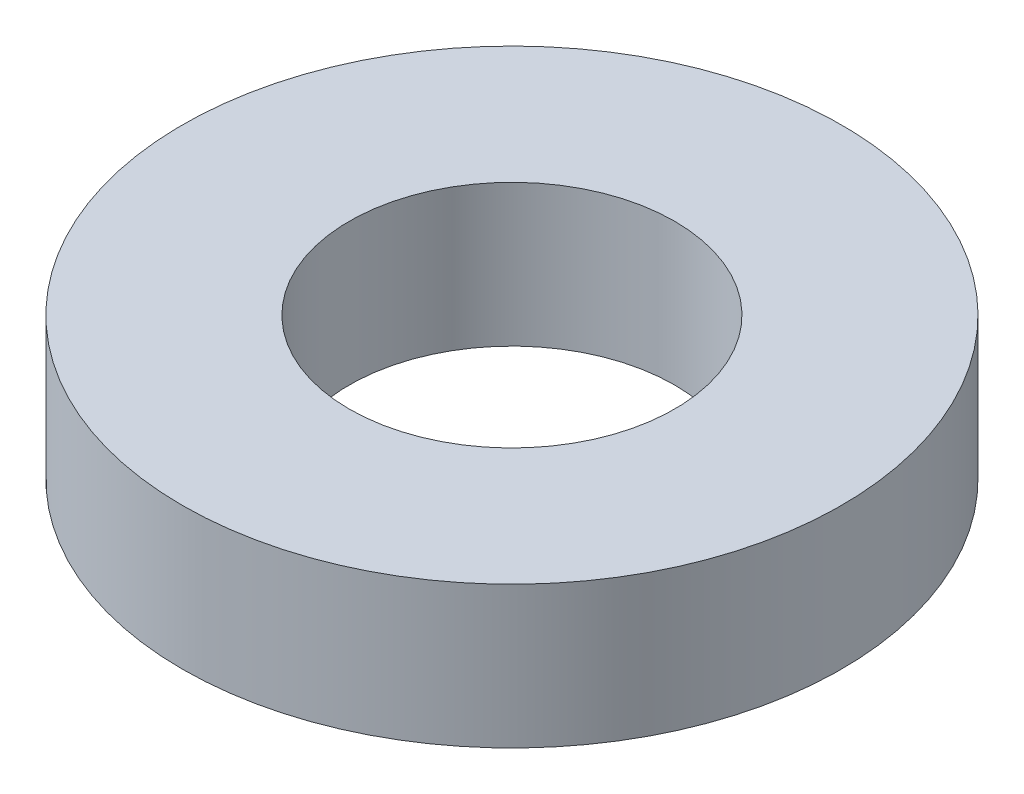
ISO-10303-21;
HEADER;
FILE_DESCRIPTION(('STEP AP214'),'2;1');
FILE_NAME('part.step','',(''),(''),'','','');
FILE_SCHEMA(('AUTOMOTIVE_DESIGN { 1 0 10303 214 1 1 1 1 }'));
ENDSEC;
DATA;
#1=APPLICATION_CONTEXT('core data for automotive mechanical design processes');
#2=APPLICATION_PROTOCOL_DEFINITION('international standard','automotive_design',2000,#1);
#3=PRODUCT_CONTEXT('',#1,'mechanical');
#4=PRODUCT('Part','Part','',(#3));
#5=PRODUCT_RELATED_PRODUCT_CATEGORY('part','',(#4));
#6=PRODUCT_DEFINITION_FORMATION('','',#4);
#7=PRODUCT_DEFINITION_CONTEXT('part definition',#1,'design');
#8=PRODUCT_DEFINITION('design','',#6,#7);
#9=PRODUCT_DEFINITION_SHAPE('','',#8);
#10=(LENGTH_UNIT() NAMED_UNIT(*) SI_UNIT(.MILLI.,.METRE.));
#11=(NAMED_UNIT(*) PLANE_ANGLE_UNIT() SI_UNIT($,.RADIAN.));
#12=(NAMED_UNIT(*) SI_UNIT($,.STERADIAN.) SOLID_ANGLE_UNIT());
#13=UNCERTAINTY_MEASURE_WITH_UNIT(LENGTH_MEASURE(1.E-05),#10,'distance_accuracy_value','');
#14=(GEOMETRIC_REPRESENTATION_CONTEXT(3) GLOBAL_UNCERTAINTY_ASSIGNED_CONTEXT((#13)) GLOBAL_UNIT_ASSIGNED_CONTEXT((#10,
#11,#12)) REPRESENTATION_CONTEXT('',''));
#15=CARTESIAN_POINT('',(0.,0.,0.));
#16=DIRECTION('',(0.,0.,1.));
#17=DIRECTION('',(1.,0.,0.));
#18=AXIS2_PLACEMENT_3D('',#15,#16,#17);
#19=CARTESIAN_POINT('',(0.,17.,0.));
#20=DIRECTION('',(0.,1.,0.));
#21=DIRECTION('',(0.,0.,1.));
#22=AXIS2_PLACEMENT_3D('',#19,#20,#21);
#23=PLANE('',#22);
#24=CARTESIAN_POINT('',(0.,17.,0.));
#25=DIRECTION('',(0.,1.,0.));
#26=DIRECTION('',(0.,0.,1.));
#27=AXIS2_PLACEMENT_3D('',#24,#25,#26);
#28=CIRCLE('',#27,39.5);
#29=CARTESIAN_POINT('',(0.,17.,39.5));
#30=VERTEX_POINT('',#29);
#31=EDGE_CURVE('E10',#30,#30,#28,.T.);
#32=ORIENTED_EDGE('',*,*,#31,.T.);
#33=EDGE_LOOP('',(#32));
#34=FACE_BOUND('',#33,.T.);
#35=CARTESIAN_POINT('',(0.,17.,0.));
#36=DIRECTION('',(0.,1.,0.));
#37=DIRECTION('',(0.,0.,1.));
#38=AXIS2_PLACEMENT_3D('',#35,#36,#37);
#39=CIRCLE('',#38,19.5);
#40=CARTESIAN_POINT('',(0.,17.,19.5));
#41=VERTEX_POINT('',#40);
#42=EDGE_CURVE('E42',#41,#41,#39,.T.);
#43=ORIENTED_EDGE('',*,*,#42,.F.);
#44=EDGE_LOOP('',(#43));
#45=FACE_BOUND('',#44,.T.);
#46=ADVANCED_FACE('F31',(#34,#45),#23,.T.);
#47=CARTESIAN_POINT('',(0.,0.,0.));
#48=DIRECTION('',(0.,1.,0.));
#49=DIRECTION('',(0.,0.,1.));
#50=AXIS2_PLACEMENT_3D('',#47,#48,#49);
#51=PLANE('',#50);
#52=CARTESIAN_POINT('',(0.,0.,0.));
#53=DIRECTION('',(0.,1.,0.));
#54=DIRECTION('',(0.,0.,1.));
#55=AXIS2_PLACEMENT_3D('',#52,#53,#54);
#56=CIRCLE('',#55,39.5);
#57=CARTESIAN_POINT('',(0.,0.,39.5));
#58=VERTEX_POINT('',#57);
#59=EDGE_CURVE('E35',#58,#58,#56,.T.);
#60=ORIENTED_EDGE('',*,*,#59,.F.);
#61=EDGE_LOOP('',(#60));
#62=FACE_BOUND('',#61,.T.);
#63=CARTESIAN_POINT('',(0.,0.,0.));
#64=DIRECTION('',(0.,1.,0.));
#65=DIRECTION('',(0.,0.,1.));
#66=AXIS2_PLACEMENT_3D('',#63,#64,#65);
#67=CIRCLE('',#66,19.5);
#68=CARTESIAN_POINT('',(0.,0.,19.5));
#69=VERTEX_POINT('',#68);
#70=EDGE_CURVE('E44',#69,#69,#67,.T.);
#71=ORIENTED_EDGE('',*,*,#70,.T.);
#72=EDGE_LOOP('',(#71));
#73=FACE_BOUND('',#72,.T.);
#74=ADVANCED_FACE('F54',(#62,#73),#51,.F.);
#75=CARTESIAN_POINT('',(0.,17.,0.));
#76=DIRECTION('',(0.,-1.,0.));
#77=DIRECTION('',(0.,0.,-1.));
#78=AXIS2_PLACEMENT_3D('',#75,#76,#77);
#79=CYLINDRICAL_SURFACE('',#78,39.5);
#80=ORIENTED_EDGE('',*,*,#31,.F.);
#81=EDGE_LOOP('',(#80));
#82=FACE_BOUND('',#81,.T.);
#83=ORIENTED_EDGE('',*,*,#59,.T.);
#84=EDGE_LOOP('',(#83));
#85=FACE_BOUND('',#84,.T.);
#86=ADVANCED_FACE('F33',(#82,#85),#79,.T.);
#87=CARTESIAN_POINT('',(0.,17.,0.));
#88=DIRECTION('',(0.,-1.,0.));
#89=DIRECTION('',(0.,0.,-1.));
#90=AXIS2_PLACEMENT_3D('',#87,#88,#89);
#91=CYLINDRICAL_SURFACE('',#90,19.5);
#92=ORIENTED_EDGE('',*,*,#42,.T.);
#93=EDGE_LOOP('',(#92));
#94=FACE_BOUND('',#93,.T.);
#95=ORIENTED_EDGE('',*,*,#70,.F.);
#96=EDGE_LOOP('',(#95));
#97=FACE_BOUND('',#96,.T.);
#98=ADVANCED_FACE('F50',(#94,#97),#91,.F.);
#99=CLOSED_SHELL('',(#46,#74,#86,#98));
#100=MANIFOLD_SOLID_BREP('B2',#99);
#101=ADVANCED_BREP_SHAPE_REPRESENTATION('',(#18,#100),#14);
#102=SHAPE_DEFINITION_REPRESENTATION(#9,#101);
ENDSEC;
END-ISO-10303-21;
